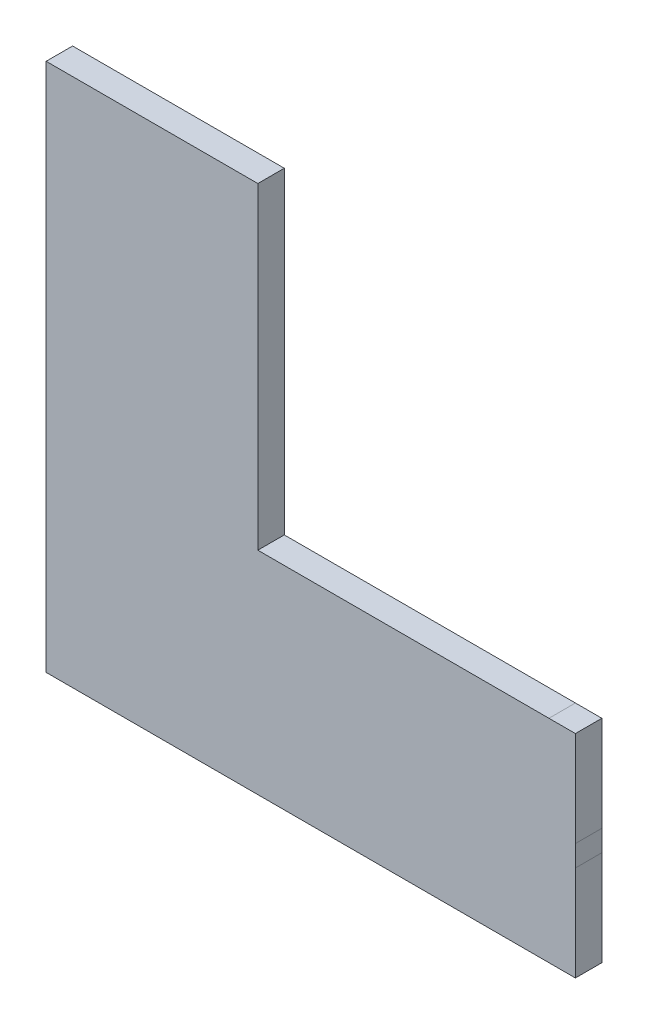
ISO-10303-21;
HEADER;
FILE_DESCRIPTION(('STEP AP214'),'2;1');
FILE_NAME('part.step','',(''),(''),'','','');
FILE_SCHEMA(('AUTOMOTIVE_DESIGN { 1 0 10303 214 1 1 1 1 }'));
ENDSEC;
DATA;
#1=APPLICATION_CONTEXT('core data for automotive mechanical design processes');
#2=APPLICATION_PROTOCOL_DEFINITION('international standard','automotive_design',2000,#1);
#3=PRODUCT_CONTEXT('',#1,'mechanical');
#4=PRODUCT('Part','Part','',(#3));
#5=PRODUCT_RELATED_PRODUCT_CATEGORY('part','',(#4));
#6=PRODUCT_DEFINITION_FORMATION('','',#4);
#7=PRODUCT_DEFINITION_CONTEXT('part definition',#1,'design');
#8=PRODUCT_DEFINITION('design','',#6,#7);
#9=PRODUCT_DEFINITION_SHAPE('','',#8);
#10=(LENGTH_UNIT() NAMED_UNIT(*) SI_UNIT(.MILLI.,.METRE.));
#11=(NAMED_UNIT(*) PLANE_ANGLE_UNIT() SI_UNIT($,.RADIAN.));
#12=(NAMED_UNIT(*) SI_UNIT($,.STERADIAN.) SOLID_ANGLE_UNIT());
#13=UNCERTAINTY_MEASURE_WITH_UNIT(LENGTH_MEASURE(1.E-05),#10,'distance_accuracy_value','');
#14=(GEOMETRIC_REPRESENTATION_CONTEXT(3) GLOBAL_UNCERTAINTY_ASSIGNED_CONTEXT((#13)) GLOBAL_UNIT_ASSIGNED_CONTEXT((#10,
#11,#12)) REPRESENTATION_CONTEXT('',''));
#15=CARTESIAN_POINT('',(0.,0.,0.));
#16=DIRECTION('',(0.,0.,1.));
#17=DIRECTION('',(1.,0.,0.));
#18=AXIS2_PLACEMENT_3D('',#15,#16,#17);
#19=CARTESIAN_POINT('',(100.,40.,5.));
#20=DIRECTION('',(0.,-1.,0.));
#21=DIRECTION('',(1.,0.,0.));
#22=AXIS2_PLACEMENT_3D('',#19,#20,#21);
#23=PLANE('',#22);
#24=DIRECTION('',(0.,0.,1.));
#25=VECTOR('',#24,1.);
#26=CARTESIAN_POINT('',(95.,40.,5.));
#27=LINE('',#26,#25);
#28=CARTESIAN_POINT('',(95.,40.,0.));
#29=VERTEX_POINT('',#28);
#30=CARTESIAN_POINT('',(95.,40.,5.));
#31=VERTEX_POINT('',#30);
#32=EDGE_CURVE('E11',#29,#31,#27,.T.);
#33=ORIENTED_EDGE('',*,*,#32,.F.);
#34=DIRECTION('',(-1.,0.,0.));
#35=VECTOR('',#34,1.);
#36=CARTESIAN_POINT('',(100.,40.,0.));
#37=LINE('',#36,#35);
#38=CARTESIAN_POINT('',(40.,40.,0.));
#39=VERTEX_POINT('',#38);
#40=EDGE_CURVE('E161',#29,#39,#37,.T.);
#41=ORIENTED_EDGE('',*,*,#40,.T.);
#42=DIRECTION('',(0.,0.,-1.));
#43=VECTOR('',#42,1.);
#44=CARTESIAN_POINT('',(40.,40.,5.));
#45=LINE('',#44,#43);
#46=CARTESIAN_POINT('',(40.,40.,5.));
#47=VERTEX_POINT('',#46);
#48=EDGE_CURVE('E182',#47,#39,#45,.T.);
#49=ORIENTED_EDGE('',*,*,#48,.F.);
#50=DIRECTION('',(-1.,0.,0.));
#51=VECTOR('',#50,1.);
#52=CARTESIAN_POINT('',(100.,40.,5.));
#53=LINE('',#52,#51);
#54=EDGE_CURVE('E178',#31,#47,#53,.T.);
#55=ORIENTED_EDGE('',*,*,#54,.F.);
#56=EDGE_LOOP('',(#33,#41,#49,#55));
#57=FACE_BOUND('',#56,.T.);
#58=ADVANCED_FACE('F38',(#57),#23,.F.);
#59=CARTESIAN_POINT('',(100.,0.,5.));
#60=DIRECTION('',(-1.,0.,0.));
#61=DIRECTION('',(0.,0.,1.));
#62=AXIS2_PLACEMENT_3D('',#59,#60,#61);
#63=PLANE('',#62);
#64=DIRECTION('',(0.,0.,-1.));
#65=VECTOR('',#64,1.);
#66=CARTESIAN_POINT('',(100.,18.,5.));
#67=LINE('',#66,#65);
#68=CARTESIAN_POINT('',(100.,18.,5.));
#69=VERTEX_POINT('',#68);
#70=CARTESIAN_POINT('',(100.,18.,0.));
#71=VERTEX_POINT('',#70);
#72=EDGE_CURVE('E47',#69,#71,#67,.T.);
#73=ORIENTED_EDGE('',*,*,#72,.F.);
#74=DIRECTION('',(0.,1.,0.));
#75=VECTOR('',#74,1.);
#76=CARTESIAN_POINT('',(100.,0.,5.));
#77=LINE('',#76,#75);
#78=CARTESIAN_POINT('',(100.,0.,5.));
#79=VERTEX_POINT('',#78);
#80=EDGE_CURVE('E179',#79,#69,#77,.T.);
#81=ORIENTED_EDGE('',*,*,#80,.F.);
#82=DIRECTION('',(0.,0.,-1.));
#83=VECTOR('',#82,1.);
#84=CARTESIAN_POINT('',(100.,0.,5.));
#85=LINE('',#84,#83);
#86=CARTESIAN_POINT('',(100.,0.,0.));
#87=VERTEX_POINT('',#86);
#88=EDGE_CURVE('E114',#79,#87,#85,.T.);
#89=ORIENTED_EDGE('',*,*,#88,.T.);
#90=DIRECTION('',(0.,1.,0.));
#91=VECTOR('',#90,1.);
#92=CARTESIAN_POINT('',(100.,0.,0.));
#93=LINE('',#92,#91);
#94=EDGE_CURVE('E156',#87,#71,#93,.T.);
#95=ORIENTED_EDGE('',*,*,#94,.T.);
#96=EDGE_LOOP('',(#73,#81,#89,#95));
#97=FACE_BOUND('',#96,.T.);
#98=ADVANCED_FACE('F160',(#97),#63,.F.);
#99=DIRECTION('',(0.,0.,1.));
#100=VECTOR('',#99,1.);
#101=CARTESIAN_POINT('',(100.,22.,5.));
#102=LINE('',#101,#100);
#103=CARTESIAN_POINT('',(100.,22.,0.));
#104=VERTEX_POINT('',#103);
#105=CARTESIAN_POINT('',(100.,22.,5.));
#106=VERTEX_POINT('',#105);
#107=EDGE_CURVE('E132',#104,#106,#102,.T.);
#108=ORIENTED_EDGE('',*,*,#107,.F.);
#109=CARTESIAN_POINT('',(100.,40.,0.));
#110=VERTEX_POINT('',#109);
#111=EDGE_CURVE('E158',#104,#110,#93,.T.);
#112=ORIENTED_EDGE('',*,*,#111,.T.);
#113=DIRECTION('',(0.,0.,-1.));
#114=VECTOR('',#113,1.);
#115=CARTESIAN_POINT('',(100.,40.,5.));
#116=LINE('',#115,#114);
#117=CARTESIAN_POINT('',(100.,40.,5.));
#118=VERTEX_POINT('',#117);
#119=EDGE_CURVE('E136',#118,#110,#116,.T.);
#120=ORIENTED_EDGE('',*,*,#119,.F.);
#121=EDGE_CURVE('E118',#106,#118,#77,.T.);
#122=ORIENTED_EDGE('',*,*,#121,.F.);
#123=EDGE_LOOP('',(#108,#112,#120,#122));
#124=FACE_BOUND('',#123,.T.);
#125=ADVANCED_FACE('F181',(#124),#63,.F.);
#126=CARTESIAN_POINT('',(0.,100.,5.));
#127=DIRECTION('',(1.,0.,0.));
#128=DIRECTION('',(0.,1.,0.));
#129=AXIS2_PLACEMENT_3D('',#126,#127,#128);
#130=PLANE('',#129);
#131=DIRECTION('',(0.,-1.,0.));
#132=VECTOR('',#131,1.);
#133=CARTESIAN_POINT('',(0.,100.,0.));
#134=LINE('',#133,#132);
#135=CARTESIAN_POINT('',(0.,100.,0.));
#136=VERTEX_POINT('',#135);
#137=CARTESIAN_POINT('',(0.,0.,0.));
#138=VERTEX_POINT('',#137);
#139=EDGE_CURVE('E131',#136,#138,#134,.T.);
#140=ORIENTED_EDGE('',*,*,#139,.T.);
#141=DIRECTION('',(0.,0.,-1.));
#142=VECTOR('',#141,1.);
#143=CARTESIAN_POINT('',(0.,0.,5.));
#144=LINE('',#143,#142);
#145=CARTESIAN_POINT('',(0.,0.,5.));
#146=VERTEX_POINT('',#145);
#147=EDGE_CURVE('E111',#146,#138,#144,.T.);
#148=ORIENTED_EDGE('',*,*,#147,.F.);
#149=DIRECTION('',(0.,-1.,0.));
#150=VECTOR('',#149,1.);
#151=CARTESIAN_POINT('',(0.,100.,5.));
#152=LINE('',#151,#150);
#153=CARTESIAN_POINT('',(0.,100.,5.));
#154=VERTEX_POINT('',#153);
#155=EDGE_CURVE('E119',#154,#146,#152,.T.);
#156=ORIENTED_EDGE('',*,*,#155,.F.);
#157=DIRECTION('',(0.,0.,-1.));
#158=VECTOR('',#157,1.);
#159=CARTESIAN_POINT('',(0.,100.,5.));
#160=LINE('',#159,#158);
#161=EDGE_CURVE('E172',#154,#136,#160,.T.);
#162=ORIENTED_EDGE('',*,*,#161,.T.);
#163=EDGE_LOOP('',(#140,#148,#156,#162));
#164=FACE_BOUND('',#163,.T.);
#165=ADVANCED_FACE('F40',(#164),#130,.F.);
#166=CARTESIAN_POINT('',(0.,0.,5.));
#167=DIRECTION('',(0.,1.,0.));
#168=DIRECTION('',(0.,0.,1.));
#169=AXIS2_PLACEMENT_3D('',#166,#167,#168);
#170=PLANE('',#169);
#171=DIRECTION('',(1.,0.,0.));
#172=VECTOR('',#171,1.);
#173=CARTESIAN_POINT('',(0.,0.,0.));
#174=LINE('',#173,#172);
#175=EDGE_CURVE('E165',#138,#87,#174,.T.);
#176=ORIENTED_EDGE('',*,*,#175,.T.);
#177=ORIENTED_EDGE('',*,*,#88,.F.);
#178=DIRECTION('',(1.,0.,0.));
#179=VECTOR('',#178,1.);
#180=CARTESIAN_POINT('',(0.,0.,5.));
#181=LINE('',#180,#179);
#182=EDGE_CURVE('E107',#146,#79,#181,.T.);
#183=ORIENTED_EDGE('',*,*,#182,.F.);
#184=ORIENTED_EDGE('',*,*,#147,.T.);
#185=EDGE_LOOP('',(#176,#177,#183,#184));
#186=FACE_BOUND('',#185,.T.);
#187=ADVANCED_FACE('F109',(#186),#170,.F.);
#188=EDGE_CURVE('E149',#69,#106,#77,.T.);
#189=ORIENTED_EDGE('',*,*,#188,.F.);
#190=ORIENTED_EDGE('',*,*,#72,.T.);
#191=EDGE_CURVE('E147',#71,#104,#93,.T.);
#192=ORIENTED_EDGE('',*,*,#191,.T.);
#193=ORIENTED_EDGE('',*,*,#107,.T.);
#194=EDGE_LOOP('',(#189,#190,#192,#193));
#195=FACE_BOUND('',#194,.T.);
#196=ADVANCED_FACE('F146',(#195),#63,.F.);
#197=EDGE_CURVE('E162',#110,#29,#37,.T.);
#198=ORIENTED_EDGE('',*,*,#197,.T.);
#199=ORIENTED_EDGE('',*,*,#32,.T.);
#200=EDGE_CURVE('E175',#118,#31,#53,.T.);
#201=ORIENTED_EDGE('',*,*,#200,.F.);
#202=ORIENTED_EDGE('',*,*,#119,.T.);
#203=EDGE_LOOP('',(#198,#199,#201,#202));
#204=FACE_BOUND('',#203,.T.);
#205=ADVANCED_FACE('F183',(#204),#23,.F.);
#206=CARTESIAN_POINT('',(40.,40.,5.));
#207=DIRECTION('',(-1.,0.,0.));
#208=DIRECTION('',(0.,0.,1.));
#209=AXIS2_PLACEMENT_3D('',#206,#207,#208);
#210=PLANE('',#209);
#211=DIRECTION('',(0.,1.,0.));
#212=VECTOR('',#211,1.);
#213=CARTESIAN_POINT('',(40.,40.,0.));
#214=LINE('',#213,#212);
#215=CARTESIAN_POINT('',(40.,100.,0.));
#216=VERTEX_POINT('',#215);
#217=EDGE_CURVE('E307',#39,#216,#214,.T.);
#218=ORIENTED_EDGE('',*,*,#217,.T.);
#219=DIRECTION('',(0.,0.,-1.));
#220=VECTOR('',#219,1.);
#221=CARTESIAN_POINT('',(40.,100.,5.));
#222=LINE('',#221,#220);
#223=CARTESIAN_POINT('',(40.,100.,5.));
#224=VERTEX_POINT('',#223);
#225=EDGE_CURVE('E305',#224,#216,#222,.T.);
#226=ORIENTED_EDGE('',*,*,#225,.F.);
#227=DIRECTION('',(0.,1.,0.));
#228=VECTOR('',#227,1.);
#229=CARTESIAN_POINT('',(40.,40.,5.));
#230=LINE('',#229,#228);
#231=EDGE_CURVE('E173',#47,#224,#230,.T.);
#232=ORIENTED_EDGE('',*,*,#231,.F.);
#233=ORIENTED_EDGE('',*,*,#48,.T.);
#234=EDGE_LOOP('',(#218,#226,#232,#233));
#235=FACE_BOUND('',#234,.T.);
#236=ADVANCED_FACE('F185',(#235),#210,.F.);
#237=CARTESIAN_POINT('',(40.,100.,5.));
#238=DIRECTION('',(0.,-1.,0.));
#239=DIRECTION('',(0.,0.,-1.));
#240=AXIS2_PLACEMENT_3D('',#237,#238,#239);
#241=PLANE('',#240);
#242=DIRECTION('',(-1.,0.,0.));
#243=VECTOR('',#242,1.);
#244=CARTESIAN_POINT('',(40.,100.,0.));
#245=LINE('',#244,#243);
#246=EDGE_CURVE('E128',#216,#136,#245,.T.);
#247=ORIENTED_EDGE('',*,*,#246,.T.);
#248=ORIENTED_EDGE('',*,*,#161,.F.);
#249=DIRECTION('',(-1.,0.,0.));
#250=VECTOR('',#249,1.);
#251=CARTESIAN_POINT('',(40.,100.,5.));
#252=LINE('',#251,#250);
#253=EDGE_CURVE('E124',#224,#154,#252,.T.);
#254=ORIENTED_EDGE('',*,*,#253,.F.);
#255=ORIENTED_EDGE('',*,*,#225,.T.);
#256=EDGE_LOOP('',(#247,#248,#254,#255));
#257=FACE_BOUND('',#256,.T.);
#258=ADVANCED_FACE('F191',(#257),#241,.F.);
#259=CARTESIAN_POINT('',(0.,0.,5.));
#260=DIRECTION('',(0.,0.,1.));
#261=DIRECTION('',(1.,0.,0.));
#262=AXIS2_PLACEMENT_3D('',#259,#260,#261);
#263=PLANE('',#262);
#264=ORIENTED_EDGE('',*,*,#155,.T.);
#265=ORIENTED_EDGE('',*,*,#182,.T.);
#266=ORIENTED_EDGE('',*,*,#80,.T.);
#267=ORIENTED_EDGE('',*,*,#188,.T.);
#268=ORIENTED_EDGE('',*,*,#121,.T.);
#269=ORIENTED_EDGE('',*,*,#200,.T.);
#270=ORIENTED_EDGE('',*,*,#54,.T.);
#271=ORIENTED_EDGE('',*,*,#231,.T.);
#272=ORIENTED_EDGE('',*,*,#253,.T.);
#273=EDGE_LOOP('',(#264,#265,#266,#267,#268,#269,#270,#271,#272));
#274=FACE_BOUND('',#273,.T.);
#275=ADVANCED_FACE('F122',(#274),#263,.T.);
#276=CARTESIAN_POINT('',(0.,0.,0.));
#277=DIRECTION('',(0.,0.,1.));
#278=DIRECTION('',(1.,0.,0.));
#279=AXIS2_PLACEMENT_3D('',#276,#277,#278);
#280=PLANE('',#279);
#281=ORIENTED_EDGE('',*,*,#139,.F.);
#282=ORIENTED_EDGE('',*,*,#246,.F.);
#283=ORIENTED_EDGE('',*,*,#217,.F.);
#284=ORIENTED_EDGE('',*,*,#40,.F.);
#285=ORIENTED_EDGE('',*,*,#197,.F.);
#286=ORIENTED_EDGE('',*,*,#111,.F.);
#287=ORIENTED_EDGE('',*,*,#191,.F.);
#288=ORIENTED_EDGE('',*,*,#94,.F.);
#289=ORIENTED_EDGE('',*,*,#175,.F.);
#290=EDGE_LOOP('',(#281,#282,#283,#284,#285,#286,#287,#288,#289));
#291=FACE_BOUND('',#290,.T.);
#292=ADVANCED_FACE('F155',(#291),#280,.F.);
#293=CLOSED_SHELL('',(#58,#98,#125,#165,#187,#196,#205,#236,#258,#275,#292));
#294=MANIFOLD_SOLID_BREP('B2',#293);
#295=ADVANCED_BREP_SHAPE_REPRESENTATION('',(#18,#294),#14);
#296=SHAPE_DEFINITION_REPRESENTATION(#9,#295);
ENDSEC;
END-ISO-10303-21;
